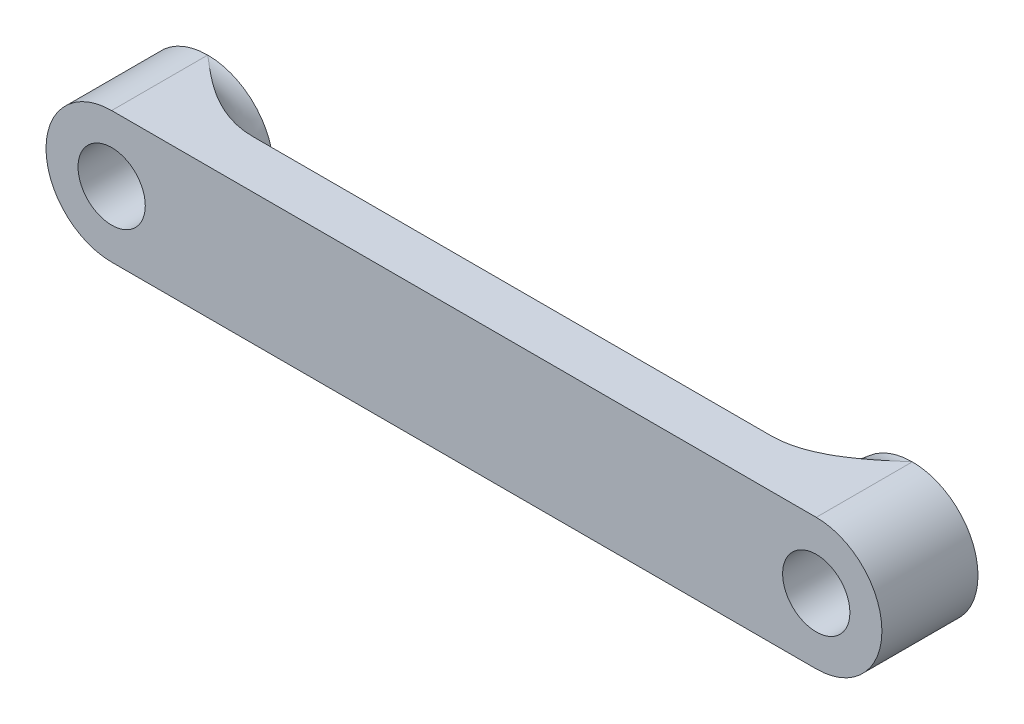
ISO-10303-21;
HEADER;
FILE_DESCRIPTION(('STEP AP214'),'2;1');
FILE_NAME('part.step','',(''),(''),'','','');
FILE_SCHEMA(('AUTOMOTIVE_DESIGN { 1 0 10303 214 1 1 1 1 }'));
ENDSEC;
DATA;
#1=APPLICATION_CONTEXT('core data for automotive mechanical design processes');
#2=APPLICATION_PROTOCOL_DEFINITION('international standard','automotive_design',2000,#1);
#3=PRODUCT_CONTEXT('',#1,'mechanical');
#4=PRODUCT('Part','Part','',(#3));
#5=PRODUCT_RELATED_PRODUCT_CATEGORY('part','',(#4));
#6=PRODUCT_DEFINITION_FORMATION('','',#4);
#7=PRODUCT_DEFINITION_CONTEXT('part definition',#1,'design');
#8=PRODUCT_DEFINITION('design','',#6,#7);
#9=PRODUCT_DEFINITION_SHAPE('','',#8);
#10=(LENGTH_UNIT() NAMED_UNIT(*) SI_UNIT(.MILLI.,.METRE.));
#11=(NAMED_UNIT(*) PLANE_ANGLE_UNIT() SI_UNIT($,.RADIAN.));
#12=(NAMED_UNIT(*) SI_UNIT($,.STERADIAN.) SOLID_ANGLE_UNIT());
#13=UNCERTAINTY_MEASURE_WITH_UNIT(LENGTH_MEASURE(1.E-05),#10,'distance_accuracy_value','');
#14=(GEOMETRIC_REPRESENTATION_CONTEXT(3) GLOBAL_UNCERTAINTY_ASSIGNED_CONTEXT((#13)) GLOBAL_UNIT_ASSIGNED_CONTEXT((#10,
#11,#12)) REPRESENTATION_CONTEXT('',''));
#15=CARTESIAN_POINT('',(0.,0.,0.));
#16=DIRECTION('',(0.,0.,1.));
#17=DIRECTION('',(1.,0.,0.));
#18=AXIS2_PLACEMENT_3D('',#15,#16,#17);
#19=CARTESIAN_POINT('',(0.,0.,-3.));
#20=DIRECTION('',(0.,0.,-1.));
#21=DIRECTION('',(1.,0.,0.));
#22=AXIS2_PLACEMENT_3D('',#19,#20,#21);
#23=PLANE('',#22);
#24=DIRECTION('',(-1.,0.,0.));
#25=VECTOR('',#24,1.);
#26=CARTESIAN_POINT('',(0.,4.1,-3.));
#27=LINE('',#26,#25);
#28=CARTESIAN_POINT('',(38.2034493015242,4.1,-3.));
#29=VERTEX_POINT('',#28);
#30=CARTESIAN_POINT('',(5.79655069847578,4.1,-3.));
#31=VERTEX_POINT('',#30);
#32=EDGE_CURVE('E132',#29,#31,#27,.T.);
#33=ORIENTED_EDGE('',*,*,#32,.F.);
#34=CARTESIAN_POINT('',(44.,0.,-3.));
#35=DIRECTION('',(0.,0.,1.));
#36=DIRECTION('',(1.,0.,0.));
#37=AXIS2_PLACEMENT_3D('',#34,#35,#36);
#38=CIRCLE('',#37,7.1);
#39=CARTESIAN_POINT('',(38.2034493015242,-4.1,-3.));
#40=VERTEX_POINT('',#39);
#41=EDGE_CURVE('E108',#40,#29,#38,.F.);
#42=ORIENTED_EDGE('',*,*,#41,.F.);
#43=DIRECTION('',(1.,0.,0.));
#44=VECTOR('',#43,1.);
#45=CARTESIAN_POINT('',(0.,-4.1,-3.));
#46=LINE('',#45,#44);
#47=CARTESIAN_POINT('',(5.79655069847578,-4.1,-3.));
#48=VERTEX_POINT('',#47);
#49=EDGE_CURVE('E137',#48,#40,#46,.T.);
#50=ORIENTED_EDGE('',*,*,#49,.F.);
#51=CARTESIAN_POINT('',(0.,0.,-3.));
#52=DIRECTION('',(0.,0.,1.));
#53=DIRECTION('',(1.,0.,0.));
#54=AXIS2_PLACEMENT_3D('',#51,#52,#53);
#55=CIRCLE('',#54,7.1);
#56=EDGE_CURVE('E145',#31,#48,#55,.F.);
#57=ORIENTED_EDGE('',*,*,#56,.F.);
#58=EDGE_LOOP('',(#33,#42,#50,#57));
#59=FACE_BOUND('',#58,.T.);
#60=ADVANCED_FACE('F43',(#59),#23,.T.);
#61=CARTESIAN_POINT('',(0.,0.,0.));
#62=DIRECTION('',(0.,0.,-1.));
#63=DIRECTION('',(1.,0.,0.));
#64=AXIS2_PLACEMENT_3D('',#61,#62,#63);
#65=PLANE('',#64);
#66=CARTESIAN_POINT('',(0.,0.,0.));
#67=DIRECTION('',(0.,0.,1.));
#68=DIRECTION('',(1.,0.,0.));
#69=AXIS2_PLACEMENT_3D('',#66,#67,#68);
#70=CIRCLE('',#69,4.1);
#71=CARTESIAN_POINT('',(0.,4.1,0.));
#72=VERTEX_POINT('',#71);
#73=CARTESIAN_POINT('',(0.,-4.1,0.));
#74=VERTEX_POINT('',#73);
#75=EDGE_CURVE('E104',#72,#74,#70,.T.);
#76=ORIENTED_EDGE('',*,*,#75,.T.);
#77=DIRECTION('',(1.,0.,0.));
#78=VECTOR('',#77,1.);
#79=CARTESIAN_POINT('',(0.,-4.1,0.));
#80=LINE('',#79,#78);
#81=CARTESIAN_POINT('',(44.,-4.1,0.));
#82=VERTEX_POINT('',#81);
#83=EDGE_CURVE('E112',#74,#82,#80,.T.);
#84=ORIENTED_EDGE('',*,*,#83,.T.);
#85=CARTESIAN_POINT('',(44.,0.,0.));
#86=DIRECTION('',(0.,0.,1.));
#87=DIRECTION('',(1.,0.,0.));
#88=AXIS2_PLACEMENT_3D('',#85,#86,#87);
#89=CIRCLE('',#88,4.1);
#90=CARTESIAN_POINT('',(44.,4.1,0.));
#91=VERTEX_POINT('',#90);
#92=EDGE_CURVE('E119',#82,#91,#89,.T.);
#93=ORIENTED_EDGE('',*,*,#92,.T.);
#94=DIRECTION('',(-1.,0.,0.));
#95=VECTOR('',#94,1.);
#96=CARTESIAN_POINT('',(0.,4.1,0.));
#97=LINE('',#96,#95);
#98=EDGE_CURVE('E125',#91,#72,#97,.T.);
#99=ORIENTED_EDGE('',*,*,#98,.T.);
#100=EDGE_LOOP('',(#76,#84,#93,#99));
#101=FACE_BOUND('',#100,.T.);
#102=CARTESIAN_POINT('',(0.,0.,0.));
#103=DIRECTION('',(0.,0.,1.));
#104=DIRECTION('',(1.,0.,0.));
#105=AXIS2_PLACEMENT_3D('',#102,#103,#104);
#106=CIRCLE('',#105,2.1);
#107=CARTESIAN_POINT('',(2.1,0.,0.));
#108=VERTEX_POINT('',#107);
#109=EDGE_CURVE('E126',#108,#108,#106,.T.);
#110=ORIENTED_EDGE('',*,*,#109,.F.);
#111=EDGE_LOOP('',(#110));
#112=FACE_BOUND('',#111,.T.);
#113=CARTESIAN_POINT('',(44.,0.,0.));
#114=DIRECTION('',(0.,0.,1.));
#115=DIRECTION('',(1.,0.,0.));
#116=AXIS2_PLACEMENT_3D('',#113,#114,#115);
#117=CIRCLE('',#116,2.1);
#118=CARTESIAN_POINT('',(46.1,0.,0.));
#119=VERTEX_POINT('',#118);
#120=EDGE_CURVE('E129',#119,#119,#117,.T.);
#121=ORIENTED_EDGE('',*,*,#120,.F.);
#122=EDGE_LOOP('',(#121));
#123=FACE_BOUND('',#122,.T.);
#124=ADVANCED_FACE('F122',(#101,#112,#123),#65,.F.);
#125=CARTESIAN_POINT('',(0.,0.,-3.));
#126=DIRECTION('',(0.,0.,1.));
#127=DIRECTION('',(-1.,0.,0.));
#128=AXIS2_PLACEMENT_3D('',#125,#126,#127);
#129=CYLINDRICAL_SURFACE('',#128,4.1);
#130=CARTESIAN_POINT('',(0.,0.,-6.));
#131=DIRECTION('',(0.,0.,1.));
#132=DIRECTION('',(1.,0.,0.));
#133=AXIS2_PLACEMENT_3D('',#130,#131,#132);
#134=CIRCLE('',#133,4.1);
#135=CARTESIAN_POINT('',(0.,4.1,-6.));
#136=VERTEX_POINT('',#135);
#137=CARTESIAN_POINT('',(0.,-4.1,-6.));
#138=VERTEX_POINT('',#137);
#139=EDGE_CURVE('E106',#136,#138,#134,.T.);
#140=ORIENTED_EDGE('',*,*,#139,.T.);
#141=DIRECTION('',(0.,0.,1.));
#142=VECTOR('',#141,1.);
#143=CARTESIAN_POINT('',(0.,-4.1,-3.));
#144=LINE('',#143,#142);
#145=EDGE_CURVE('E99',#138,#74,#144,.T.);
#146=ORIENTED_EDGE('',*,*,#145,.T.);
#147=ORIENTED_EDGE('',*,*,#75,.F.);
#148=DIRECTION('',(0.,0.,1.));
#149=VECTOR('',#148,1.);
#150=CARTESIAN_POINT('',(0.,4.1,-3.));
#151=LINE('',#150,#149);
#152=EDGE_CURVE('E138',#136,#72,#151,.T.);
#153=ORIENTED_EDGE('',*,*,#152,.F.);
#154=EDGE_LOOP('',(#140,#146,#147,#153));
#155=FACE_BOUND('',#154,.T.);
#156=ADVANCED_FACE('F101',(#155),#129,.T.);
#157=CARTESIAN_POINT('',(0.,-4.1,-3.));
#158=DIRECTION('',(0.,1.,0.));
#159=DIRECTION('',(0.,0.,-1.));
#160=AXIS2_PLACEMENT_3D('',#157,#158,#159);
#161=PLANE('',#160);
#162=ORIENTED_EDGE('',*,*,#83,.F.);
#163=ORIENTED_EDGE('',*,*,#145,.F.);
#164=CARTESIAN_POINT('',(5.79655069847578,-4.1,-3.));
#165=CARTESIAN_POINT('',(5.66879302755392,-4.1,-2.99999294841604));
#166=CARTESIAN_POINT('',(5.54110019157879,-4.1,-3.00543769285001));
#167=CARTESIAN_POINT('',(5.28667422609088,-4.1,-3.02643615494525));
#168=CARTESIAN_POINT('',(5.15994022751674,-4.1,-3.04197922068613));
#169=CARTESIAN_POINT('',(4.90928005236923,-4.1,-3.08217611628567));
#170=CARTESIAN_POINT('',(4.78533841253872,-4.1,-3.10673501398964));
#171=CARTESIAN_POINT('',(4.5394004995021,-4.1,-3.16420013503755));
#172=CARTESIAN_POINT('',(4.41740464105675,-4.1,-3.19710811344205));
#173=CARTESIAN_POINT('',(4.09882616711366,-4.1,-3.29385491692368));
#174=CARTESIAN_POINT('',(3.90415820029286,-4.1,-3.36405393823642));
#175=CARTESIAN_POINT('',(3.52185201015864,-4.1,-3.52145684501468));
#176=CARTESIAN_POINT('',(3.33421743788177,-4.1,-3.60866942038805));
#177=CARTESIAN_POINT('',(2.78017794221224,-4.1,-3.892217806084));
#178=CARTESIAN_POINT('',(2.42466487968994,-4.1,-4.10978784015526));
#179=CARTESIAN_POINT('',(1.71676320911629,-4.1,-4.59404088743045));
#180=CARTESIAN_POINT('',(1.36597402479346,-4.1,-4.86295064544594));
#181=CARTESIAN_POINT('',(0.680013719460306,-4.1,-5.4184648369141));
#182=CARTESIAN_POINT('',(0.344820276268,-4.1,-5.7050425238953));
#183=CARTESIAN_POINT('',(0.0064877367268072,-4.1,-5.99445039728565));
#184=CARTESIAN_POINT('',(0.00324386682303889,-4.1,-5.99722520011665));
#185=CARTESIAN_POINT('',(0.,-4.1,-6.));
#186=B_SPLINE_CURVE_WITH_KNOTS('',3,(#164,#165,#166,#167,#168,#169,#170,#171,#172,#173,#174,
#175,#176,#177,#178,#179,#180,#181,#182,#183,#184,#185),.UNSPECIFIED.,.F.,.F.,(4,2,2,2,2,2,2,2,
2,2,4),(0.,0.38306240344252,0.76572139923725,1.14446163732001,1.52328155646243,2.14305439451351,
2.76314462285997,4.00966185663654,5.33448962406429,6.65735884377305,6.67016509224793),.UNSPECIFIED.);
#187=EDGE_CURVE('E154',#48,#138,#186,.T.);
#188=ORIENTED_EDGE('',*,*,#187,.F.);
#189=ORIENTED_EDGE('',*,*,#49,.T.);
#190=CARTESIAN_POINT('',(38.2034493015242,-4.1,-3.));
#191=CARTESIAN_POINT('',(38.3312069724461,-4.1,-2.99999294841604));
#192=CARTESIAN_POINT('',(38.4588998084212,-4.1,-3.00543769285001));
#193=CARTESIAN_POINT('',(38.7133257739091,-4.1,-3.02643615494525));
#194=CARTESIAN_POINT('',(38.8400597724833,-4.1,-3.04197922068613));
#195=CARTESIAN_POINT('',(39.0907199476308,-4.1,-3.08217611628567));
#196=CARTESIAN_POINT('',(39.2146615874613,-4.1,-3.10673501398963));
#197=CARTESIAN_POINT('',(39.4605995004979,-4.1,-3.16420013503754));
#198=CARTESIAN_POINT('',(39.5825953589433,-4.1,-3.19710811344205));
#199=CARTESIAN_POINT('',(39.9011738328863,-4.1,-3.29385491692368));
#200=CARTESIAN_POINT('',(40.0958417997071,-4.1,-3.36405393823642));
#201=CARTESIAN_POINT('',(40.4781479898414,-4.1,-3.52145684501468));
#202=CARTESIAN_POINT('',(40.6657825621182,-4.1,-3.60866942038805));
#203=CARTESIAN_POINT('',(41.2198220577878,-4.1,-3.89221780608401));
#204=CARTESIAN_POINT('',(41.5753351203101,-4.1,-4.10978784015526));
#205=CARTESIAN_POINT('',(42.2832367908837,-4.1,-4.59404088743046));
#206=CARTESIAN_POINT('',(42.6340259752065,-4.1,-4.86295064544595));
#207=CARTESIAN_POINT('',(43.3199862805397,-4.1,-5.4184648369141));
#208=CARTESIAN_POINT('',(43.655179723732,-4.1,-5.70504252389526));
#209=CARTESIAN_POINT('',(43.9935122632732,-4.1,-5.99445039728565));
#210=CARTESIAN_POINT('',(43.996756133177,-4.1,-5.99722520011665));
#211=CARTESIAN_POINT('',(44.,-4.1,-6.));
#212=B_SPLINE_CURVE_WITH_KNOTS('',3,(#190,#191,#192,#193,#194,#195,#196,#197,#198,#199,#200,
#201,#202,#203,#204,#205,#206,#207,#208,#209,#210,#211),.UNSPECIFIED.,.F.,.F.,(4,2,2,2,2,2,2,2,
2,2,4),(0.,0.383062403442529,0.765721399237252,1.14446163731999,1.52328155646243,
2.14305439451351,2.76314462285997,4.00966185663655,5.3344896240643,6.65735884377305,
6.67016509224793),.UNSPECIFIED.);
#213=CARTESIAN_POINT('',(44.,-4.10000000000001,-6.));
#214=VERTEX_POINT('',#213);
#215=EDGE_CURVE('E57',#214,#40,#212,.F.);
#216=ORIENTED_EDGE('',*,*,#215,.F.);
#217=DIRECTION('',(0.,0.,1.));
#218=VECTOR('',#217,1.);
#219=CARTESIAN_POINT('',(44.,-4.1,-3.));
#220=LINE('',#219,#218);
#221=EDGE_CURVE('E109',#214,#82,#220,.T.);
#222=ORIENTED_EDGE('',*,*,#221,.T.);
#223=EDGE_LOOP('',(#162,#163,#188,#189,#216,#222));
#224=FACE_BOUND('',#223,.T.);
#225=ADVANCED_FACE('F113',(#224),#161,.F.);
#226=CARTESIAN_POINT('',(44.,0.,-3.));
#227=DIRECTION('',(0.,0.,1.));
#228=DIRECTION('',(-1.,0.,0.));
#229=AXIS2_PLACEMENT_3D('',#226,#227,#228);
#230=CYLINDRICAL_SURFACE('',#229,4.1);
#231=CARTESIAN_POINT('',(44.,0.,-6.));
#232=DIRECTION('',(0.,0.,1.));
#233=DIRECTION('',(1.,0.,0.));
#234=AXIS2_PLACEMENT_3D('',#231,#232,#233);
#235=CIRCLE('',#234,4.10000000000001);
#236=CARTESIAN_POINT('',(44.,4.10000000000001,-6.));
#237=VERTEX_POINT('',#236);
#238=EDGE_CURVE('E194',#214,#237,#235,.T.);
#239=ORIENTED_EDGE('',*,*,#238,.T.);
#240=DIRECTION('',(0.,0.,1.));
#241=VECTOR('',#240,1.);
#242=CARTESIAN_POINT('',(44.,4.1,-3.));
#243=LINE('',#242,#241);
#244=EDGE_CURVE('E140',#237,#91,#243,.T.);
#245=ORIENTED_EDGE('',*,*,#244,.T.);
#246=ORIENTED_EDGE('',*,*,#92,.F.);
#247=ORIENTED_EDGE('',*,*,#221,.F.);
#248=EDGE_LOOP('',(#239,#245,#246,#247));
#249=FACE_BOUND('',#248,.T.);
#250=ADVANCED_FACE('F174',(#249),#230,.T.);
#251=CARTESIAN_POINT('',(0.,4.1,-3.));
#252=DIRECTION('',(0.,-1.,0.));
#253=DIRECTION('',(0.,0.,1.));
#254=AXIS2_PLACEMENT_3D('',#251,#252,#253);
#255=PLANE('',#254);
#256=ORIENTED_EDGE('',*,*,#98,.F.);
#257=ORIENTED_EDGE('',*,*,#244,.F.);
#258=CARTESIAN_POINT('',(38.2034493015242,4.1,-3.));
#259=CARTESIAN_POINT('',(38.3312069724461,4.1,-2.99999294841604));
#260=CARTESIAN_POINT('',(38.4588998084212,4.1,-3.00543769285001));
#261=CARTESIAN_POINT('',(38.7133257739091,4.1,-3.02643615494525));
#262=CARTESIAN_POINT('',(38.8400597724833,4.1,-3.04197922068613));
#263=CARTESIAN_POINT('',(39.0907199476308,4.1,-3.08217611628567));
#264=CARTESIAN_POINT('',(39.2146615874613,4.1,-3.10673501398963));
#265=CARTESIAN_POINT('',(39.4605995004979,4.1,-3.16420013503754));
#266=CARTESIAN_POINT('',(39.5825953589433,4.1,-3.19710811344205));
#267=CARTESIAN_POINT('',(39.9011738328863,4.1,-3.29385491692368));
#268=CARTESIAN_POINT('',(40.0958417997071,4.1,-3.36405393823642));
#269=CARTESIAN_POINT('',(40.4781479898414,4.1,-3.52145684501468));
#270=CARTESIAN_POINT('',(40.6657825621182,4.1,-3.60866942038805));
#271=CARTESIAN_POINT('',(41.2198220577878,4.1,-3.89221780608401));
#272=CARTESIAN_POINT('',(41.5753351203101,4.1,-4.10978784015526));
#273=CARTESIAN_POINT('',(42.2832367908837,4.1,-4.59404088743046));
#274=CARTESIAN_POINT('',(42.6340259752065,4.1,-4.86295064544595));
#275=CARTESIAN_POINT('',(43.3199862805397,4.1,-5.4184648369141));
#276=CARTESIAN_POINT('',(43.655179723732,4.1,-5.70504252389526));
#277=CARTESIAN_POINT('',(43.9935122632732,4.1,-5.99445039728565));
#278=CARTESIAN_POINT('',(43.996756133177,4.1,-5.99722520011665));
#279=CARTESIAN_POINT('',(44.,4.1,-6.));
#280=B_SPLINE_CURVE_WITH_KNOTS('',3,(#258,#259,#260,#261,#262,#263,#264,#265,#266,#267,#268,
#269,#270,#271,#272,#273,#274,#275,#276,#277,#278,#279),.UNSPECIFIED.,.F.,.F.,(4,2,2,2,2,2,2,2,
2,2,4),(0.,0.383062403442529,0.765721399237252,1.14446163731999,1.52328155646243,
2.14305439451351,2.76314462285997,4.00966185663655,5.3344896240643,6.65735884377305,
6.67016509224793),.UNSPECIFIED.);
#281=EDGE_CURVE('E11',#29,#237,#280,.T.);
#282=ORIENTED_EDGE('',*,*,#281,.F.);
#283=ORIENTED_EDGE('',*,*,#32,.T.);
#284=CARTESIAN_POINT('',(5.79655069847578,4.1,-3.));
#285=CARTESIAN_POINT('',(5.66879302755392,4.1,-2.99999294841604));
#286=CARTESIAN_POINT('',(5.54110019157879,4.1,-3.00543769285001));
#287=CARTESIAN_POINT('',(5.28667422609088,4.1,-3.02643615494525));
#288=CARTESIAN_POINT('',(5.15994022751674,4.1,-3.04197922068613));
#289=CARTESIAN_POINT('',(4.90928005236923,4.1,-3.08217611628567));
#290=CARTESIAN_POINT('',(4.78533841253872,4.1,-3.10673501398964));
#291=CARTESIAN_POINT('',(4.5394004995021,4.1,-3.16420013503755));
#292=CARTESIAN_POINT('',(4.41740464105675,4.1,-3.19710811344205));
#293=CARTESIAN_POINT('',(4.09882616711366,4.1,-3.29385491692368));
#294=CARTESIAN_POINT('',(3.90415820029286,4.1,-3.36405393823642));
#295=CARTESIAN_POINT('',(3.52185201015864,4.1,-3.52145684501468));
#296=CARTESIAN_POINT('',(3.33421743788177,4.1,-3.60866942038805));
#297=CARTESIAN_POINT('',(2.78017794221224,4.1,-3.892217806084));
#298=CARTESIAN_POINT('',(2.42466487968994,4.1,-4.10978784015526));
#299=CARTESIAN_POINT('',(1.71676320911629,4.1,-4.59404088743045));
#300=CARTESIAN_POINT('',(1.36597402479346,4.1,-4.86295064544594));
#301=CARTESIAN_POINT('',(0.680013719460306,4.1,-5.4184648369141));
#302=CARTESIAN_POINT('',(0.344820276268,4.1,-5.7050425238953));
#303=CARTESIAN_POINT('',(0.0064877367268072,4.1,-5.99445039728565));
#304=CARTESIAN_POINT('',(0.00324386682303889,4.1,-5.99722520011665));
#305=CARTESIAN_POINT('',(0.,4.1,-6.));
#306=B_SPLINE_CURVE_WITH_KNOTS('',3,(#284,#285,#286,#287,#288,#289,#290,#291,#292,#293,#294,
#295,#296,#297,#298,#299,#300,#301,#302,#303,#304,#305),.UNSPECIFIED.,.F.,.F.,(4,2,2,2,2,2,2,2,
2,2,4),(0.,0.38306240344252,0.76572139923725,1.14446163732001,1.52328155646243,2.14305439451351,
2.76314462285997,4.00966185663654,5.33448962406429,6.65735884377305,6.67016509224793),.UNSPECIFIED.);
#307=EDGE_CURVE('E148',#136,#31,#306,.F.);
#308=ORIENTED_EDGE('',*,*,#307,.F.);
#309=ORIENTED_EDGE('',*,*,#152,.T.);
#310=EDGE_LOOP('',(#256,#257,#282,#283,#308,#309));
#311=FACE_BOUND('',#310,.T.);
#312=ADVANCED_FACE('F160',(#311),#255,.F.);
#313=CARTESIAN_POINT('',(0.,0.,-3.));
#314=DIRECTION('',(0.,0.,1.));
#315=DIRECTION('',(-1.,0.,0.));
#316=AXIS2_PLACEMENT_3D('',#313,#314,#315);
#317=CYLINDRICAL_SURFACE('',#316,2.1);
#318=ORIENTED_EDGE('',*,*,#109,.T.);
#319=EDGE_LOOP('',(#318));
#320=FACE_BOUND('',#319,.T.);
#321=CARTESIAN_POINT('',(0.,0.,-6.));
#322=DIRECTION('',(0.,0.,1.));
#323=DIRECTION('',(1.,0.,0.));
#324=AXIS2_PLACEMENT_3D('',#321,#322,#323);
#325=CIRCLE('',#324,2.1);
#326=CARTESIAN_POINT('',(2.1,0.,-6.));
#327=VERTEX_POINT('',#326);
#328=EDGE_CURVE('E200',#327,#327,#325,.T.);
#329=ORIENTED_EDGE('',*,*,#328,.F.);
#330=EDGE_LOOP('',(#329));
#331=FACE_BOUND('',#330,.T.);
#332=ADVANCED_FACE('F216',(#320,#331),#317,.F.);
#333=CARTESIAN_POINT('',(44.,0.,-3.));
#334=DIRECTION('',(0.,0.,1.));
#335=DIRECTION('',(-1.,0.,0.));
#336=AXIS2_PLACEMENT_3D('',#333,#334,#335);
#337=CYLINDRICAL_SURFACE('',#336,2.1);
#338=ORIENTED_EDGE('',*,*,#120,.T.);
#339=EDGE_LOOP('',(#338));
#340=FACE_BOUND('',#339,.T.);
#341=CARTESIAN_POINT('',(44.,0.,-6.));
#342=DIRECTION('',(0.,0.,1.));
#343=DIRECTION('',(1.,0.,0.));
#344=AXIS2_PLACEMENT_3D('',#341,#342,#343);
#345=CIRCLE('',#344,2.1);
#346=CARTESIAN_POINT('',(46.1,0.,-6.));
#347=VERTEX_POINT('',#346);
#348=EDGE_CURVE('E196',#347,#347,#345,.T.);
#349=ORIENTED_EDGE('',*,*,#348,.F.);
#350=EDGE_LOOP('',(#349));
#351=FACE_BOUND('',#350,.T.);
#352=ADVANCED_FACE('F207',(#340,#351),#337,.F.);
#353=CARTESIAN_POINT('',(0.,0.,-6.));
#354=DIRECTION('',(0.,0.,-1.));
#355=DIRECTION('',(1.,0.,0.));
#356=AXIS2_PLACEMENT_3D('',#353,#354,#355);
#357=PLANE('',#356);
#358=ORIENTED_EDGE('',*,*,#139,.F.);
#359=EDGE_CURVE('E182',#138,#136,#134,.T.);
#360=ORIENTED_EDGE('',*,*,#359,.F.);
#361=EDGE_LOOP('',(#358,#360));
#362=FACE_BOUND('',#361,.T.);
#363=ORIENTED_EDGE('',*,*,#328,.T.);
#364=EDGE_LOOP('',(#363));
#365=FACE_BOUND('',#364,.T.);
#366=ADVANCED_FACE('F222',(#362,#365),#357,.T.);
#367=CARTESIAN_POINT('',(44.,0.,-6.));
#368=DIRECTION('',(0.,0.,-1.));
#369=DIRECTION('',(1.,0.,0.));
#370=AXIS2_PLACEMENT_3D('',#367,#368,#369);
#371=PLANE('',#370);
#372=EDGE_CURVE('E63',#237,#214,#235,.T.);
#373=ORIENTED_EDGE('',*,*,#372,.F.);
#374=ORIENTED_EDGE('',*,*,#238,.F.);
#375=EDGE_LOOP('',(#373,#374));
#376=FACE_BOUND('',#375,.T.);
#377=ORIENTED_EDGE('',*,*,#348,.T.);
#378=EDGE_LOOP('',(#377));
#379=FACE_BOUND('',#378,.T.);
#380=ADVANCED_FACE('F168',(#376,#379),#371,.T.);
#381=CARTESIAN_POINT('',(0.,0.,-6.));
#382=DIRECTION('',(0.,0.,-1.));
#383=DIRECTION('',(1.,0.,0.));
#384=AXIS2_PLACEMENT_3D('',#381,#382,#383);
#385=TOROIDAL_SURFACE('',#384,7.1,3.);
#386=ORIENTED_EDGE('',*,*,#187,.T.);
#387=ORIENTED_EDGE('',*,*,#359,.T.);
#388=ORIENTED_EDGE('',*,*,#307,.T.);
#389=ORIENTED_EDGE('',*,*,#56,.T.);
#390=EDGE_LOOP('',(#386,#387,#388,#389));
#391=FACE_BOUND('',#390,.T.);
#392=ADVANCED_FACE('F164',(#391),#385,.F.);
#393=CARTESIAN_POINT('',(44.,0.,-6.));
#394=DIRECTION('',(0.,0.,-1.));
#395=DIRECTION('',(1.,0.,0.));
#396=AXIS2_PLACEMENT_3D('',#393,#394,#395);
#397=TOROIDAL_SURFACE('',#396,7.1,3.);
#398=ORIENTED_EDGE('',*,*,#281,.T.);
#399=ORIENTED_EDGE('',*,*,#372,.T.);
#400=ORIENTED_EDGE('',*,*,#215,.T.);
#401=ORIENTED_EDGE('',*,*,#41,.T.);
#402=EDGE_LOOP('',(#398,#399,#400,#401));
#403=FACE_BOUND('',#402,.T.);
#404=ADVANCED_FACE('F45',(#403),#397,.F.);
#405=CLOSED_SHELL('',(#60,#124,#156,#225,#250,#312,#332,#352,#366,#380,#392,#404));
#406=MANIFOLD_SOLID_BREP('B2',#405);
#407=ADVANCED_BREP_SHAPE_REPRESENTATION('',(#18,#406),#14);
#408=SHAPE_DEFINITION_REPRESENTATION(#9,#407);
ENDSEC;
END-ISO-10303-21;
